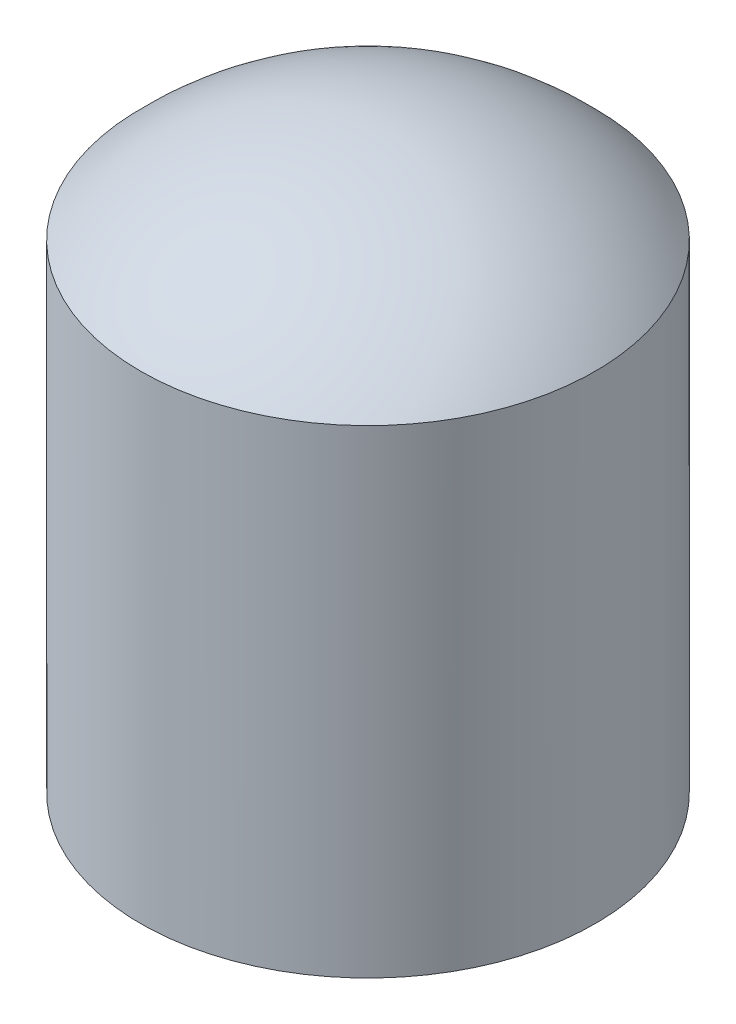
ISO-10303-21;
HEADER;
FILE_DESCRIPTION(('STEP AP214'),'2;1');
FILE_NAME('part.step','',(''),(''),'','','');
FILE_SCHEMA(('AUTOMOTIVE_DESIGN { 1 0 10303 214 1 1 1 1 }'));
ENDSEC;
DATA;
#1=APPLICATION_CONTEXT('core data for automotive mechanical design processes');
#2=APPLICATION_PROTOCOL_DEFINITION('international standard','automotive_design',2000,#1);
#3=PRODUCT_CONTEXT('',#1,'mechanical');
#4=PRODUCT('Part','Part','',(#3));
#5=PRODUCT_RELATED_PRODUCT_CATEGORY('part','',(#4));
#6=PRODUCT_DEFINITION_FORMATION('','',#4);
#7=PRODUCT_DEFINITION_CONTEXT('part definition',#1,'design');
#8=PRODUCT_DEFINITION('design','',#6,#7);
#9=PRODUCT_DEFINITION_SHAPE('','',#8);
#10=(LENGTH_UNIT() NAMED_UNIT(*) SI_UNIT(.MILLI.,.METRE.));
#11=(NAMED_UNIT(*) PLANE_ANGLE_UNIT() SI_UNIT($,.RADIAN.));
#12=(NAMED_UNIT(*) SI_UNIT($,.STERADIAN.) SOLID_ANGLE_UNIT());
#13=UNCERTAINTY_MEASURE_WITH_UNIT(LENGTH_MEASURE(1.E-05),#10,'distance_accuracy_value','');
#14=(GEOMETRIC_REPRESENTATION_CONTEXT(3) GLOBAL_UNCERTAINTY_ASSIGNED_CONTEXT((#13)) GLOBAL_UNIT_ASSIGNED_CONTEXT((#10,
#11,#12)) REPRESENTATION_CONTEXT('',''));
#15=CARTESIAN_POINT('',(0.,0.,0.));
#16=DIRECTION('',(0.,0.,1.));
#17=DIRECTION('',(1.,0.,0.));
#18=AXIS2_PLACEMENT_3D('',#15,#16,#17);
#19=CARTESIAN_POINT('',(0.,0.,19.));
#20=DIRECTION('',(0.,1.,0.));
#21=DIRECTION('',(0.,0.,1.));
#22=AXIS2_PLACEMENT_3D('',#19,#20,#21);
#23=PLANE('',#22);
#24=CARTESIAN_POINT('',(0.,0.,0.));
#25=DIRECTION('',(0.,-1.,0.));
#26=DIRECTION('',(0.,0.,-1.));
#27=AXIS2_PLACEMENT_3D('',#24,#25,#26);
#28=CIRCLE('',#27,17.);
#29=CARTESIAN_POINT('',(0.,0.,-17.));
#30=VERTEX_POINT('',#29);
#31=EDGE_CURVE('E45',#30,#30,#28,.T.);
#32=ORIENTED_EDGE('',*,*,#31,.F.);
#33=EDGE_LOOP('',(#32));
#34=FACE_BOUND('',#33,.T.);
#35=CARTESIAN_POINT('',(0.,0.,0.));
#36=DIRECTION('',(0.,-1.,0.));
#37=DIRECTION('',(0.,0.,-1.));
#38=AXIS2_PLACEMENT_3D('',#35,#36,#37);
#39=CIRCLE('',#38,19.);
#40=CARTESIAN_POINT('',(0.,0.,-19.));
#41=VERTEX_POINT('',#40);
#42=EDGE_CURVE('E10',#41,#41,#39,.T.);
#43=ORIENTED_EDGE('',*,*,#42,.T.);
#44=EDGE_LOOP('',(#43));
#45=FACE_BOUND('',#44,.T.);
#46=ADVANCED_FACE('F31',(#34,#45),#23,.F.);
#47=CARTESIAN_POINT('',(0.,46.2488094968134,0.));
#48=DIRECTION('',(0.,-1.,0.));
#49=DIRECTION('',(0.,0.,-1.));
#50=AXIS2_PLACEMENT_3D('',#47,#48,#49);
#51=CYLINDRICAL_SURFACE('',#50,19.);
#52=ORIENTED_EDGE('',*,*,#42,.F.);
#53=EDGE_LOOP('',(#52));
#54=FACE_BOUND('',#53,.T.);
#55=CARTESIAN_POINT('',(0.,40.,0.));
#56=DIRECTION('',(0.,-1.,0.));
#57=DIRECTION('',(0.,0.,-1.));
#58=AXIS2_PLACEMENT_3D('',#55,#56,#57);
#59=CIRCLE('',#58,19.);
#60=CARTESIAN_POINT('',(0.,40.,-19.));
#61=VERTEX_POINT('',#60);
#62=EDGE_CURVE('E37',#61,#61,#59,.T.);
#63=ORIENTED_EDGE('',*,*,#62,.T.);
#64=EDGE_LOOP('',(#63));
#65=FACE_BOUND('',#64,.T.);
#66=ADVANCED_FACE('F54',(#54,#65),#51,.T.);
#67=CARTESIAN_POINT('',(0.,22.,0.));
#68=DIRECTION('',(0.,-1.,0.));
#69=DIRECTION('',(0.,0.,1.));
#70=AXIS2_PLACEMENT_3D('',#67,#68,#69);
#71=SPHERICAL_SURFACE('',#70,26.1725046566048);
#72=ORIENTED_EDGE('',*,*,#62,.F.);
#73=EDGE_LOOP('',(#72));
#74=FACE_BOUND('',#73,.T.);
#75=ADVANCED_FACE('F58',(#74),#71,.T.);
#76=CARTESIAN_POINT('',(0.,20.,0.));
#77=DIRECTION('',(0.,-1.,0.));
#78=DIRECTION('',(0.,0.,1.));
#79=AXIS2_PLACEMENT_3D('',#76,#77,#78);
#80=SPHERICAL_SURFACE('',#79,26.2488094968134);
#81=CARTESIAN_POINT('',(0.,40.,0.));
#82=DIRECTION('',(0.,-1.,0.));
#83=DIRECTION('',(0.,0.,-1.));
#84=AXIS2_PLACEMENT_3D('',#81,#82,#83);
#85=CIRCLE('',#84,17.);
#86=CARTESIAN_POINT('',(0.,40.,-17.));
#87=VERTEX_POINT('',#86);
#88=EDGE_CURVE('E41',#87,#87,#85,.T.);
#89=ORIENTED_EDGE('',*,*,#88,.T.);
#90=EDGE_LOOP('',(#89));
#91=FACE_BOUND('',#90,.T.);
#92=ADVANCED_FACE('F63',(#91),#80,.F.);
#93=CARTESIAN_POINT('',(0.,46.2488094968134,0.));
#94=DIRECTION('',(0.,-1.,0.));
#95=DIRECTION('',(0.,0.,-1.));
#96=AXIS2_PLACEMENT_3D('',#93,#94,#95);
#97=CYLINDRICAL_SURFACE('',#96,17.);
#98=ORIENTED_EDGE('',*,*,#88,.F.);
#99=EDGE_LOOP('',(#98));
#100=FACE_BOUND('',#99,.T.);
#101=ORIENTED_EDGE('',*,*,#31,.T.);
#102=EDGE_LOOP('',(#101));
#103=FACE_BOUND('',#102,.T.);
#104=ADVANCED_FACE('F51',(#100,#103),#97,.F.);
#105=CLOSED_SHELL('',(#46,#66,#75,#92,#104));
#106=MANIFOLD_SOLID_BREP('B2',#105);
#107=ADVANCED_BREP_SHAPE_REPRESENTATION('',(#18,#106),#14);
#108=SHAPE_DEFINITION_REPRESENTATION(#9,#107);
ENDSEC;
END-ISO-10303-21;
